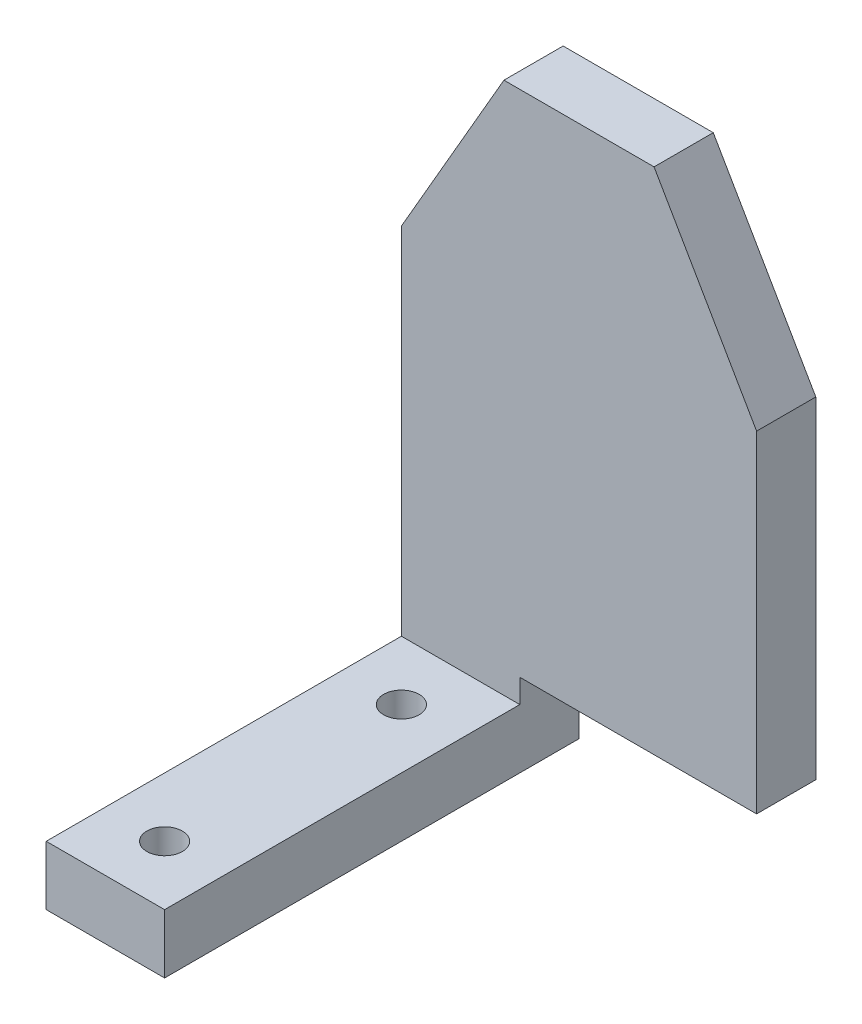
ISO-10303-21;
HEADER;
FILE_DESCRIPTION(('STEP AP214'),'2;1');
FILE_NAME('part.step','',(''),(''),'','','');
FILE_SCHEMA(('AUTOMOTIVE_DESIGN { 1 0 10303 214 1 1 1 1 }'));
ENDSEC;
DATA;
#1=APPLICATION_CONTEXT('core data for automotive mechanical design processes');
#2=APPLICATION_PROTOCOL_DEFINITION('international standard','automotive_design',2000,#1);
#3=PRODUCT_CONTEXT('',#1,'mechanical');
#4=PRODUCT('Part','Part','',(#3));
#5=PRODUCT_RELATED_PRODUCT_CATEGORY('part','',(#4));
#6=PRODUCT_DEFINITION_FORMATION('','',#4);
#7=PRODUCT_DEFINITION_CONTEXT('part definition',#1,'design');
#8=PRODUCT_DEFINITION('design','',#6,#7);
#9=PRODUCT_DEFINITION_SHAPE('','',#8);
#10=(LENGTH_UNIT() NAMED_UNIT(*) SI_UNIT(.MILLI.,.METRE.));
#11=(NAMED_UNIT(*) PLANE_ANGLE_UNIT() SI_UNIT($,.RADIAN.));
#12=(NAMED_UNIT(*) SI_UNIT($,.STERADIAN.) SOLID_ANGLE_UNIT());
#13=UNCERTAINTY_MEASURE_WITH_UNIT(LENGTH_MEASURE(1.E-05),#10,'distance_accuracy_value','');
#14=(GEOMETRIC_REPRESENTATION_CONTEXT(3) GLOBAL_UNCERTAINTY_ASSIGNED_CONTEXT((#13)) GLOBAL_UNIT_ASSIGNED_CONTEXT((#10,
#11,#12)) REPRESENTATION_CONTEXT('',''));
#15=CARTESIAN_POINT('',(0.,0.,0.));
#16=DIRECTION('',(0.,0.,1.));
#17=DIRECTION('',(1.,0.,0.));
#18=AXIS2_PLACEMENT_3D('',#15,#16,#17);
#19=CARTESIAN_POINT('',(0.,0.,5.));
#20=DIRECTION('',(0.,0.,-1.));
#21=DIRECTION('',(-1.,0.,0.));
#22=AXIS2_PLACEMENT_3D('',#19,#20,#21);
#23=PLANE('',#22);
#24=DIRECTION('',(0.,-1.,0.));
#25=VECTOR('',#24,1.);
#26=CARTESIAN_POINT('',(10.,0.,5.));
#27=LINE('',#26,#25);
#28=CARTESIAN_POINT('',(10.,7.,5.));
#29=VERTEX_POINT('',#28);
#30=CARTESIAN_POINT('',(10.,5.,5.));
#31=VERTEX_POINT('',#30);
#32=EDGE_CURVE('E133',#29,#31,#27,.T.);
#33=ORIENTED_EDGE('',*,*,#32,.F.);
#34=DIRECTION('',(-1.,0.,0.));
#35=VECTOR('',#34,1.);
#36=CARTESIAN_POINT('',(10.,7.,5.));
#37=LINE('',#36,#35);
#38=CARTESIAN_POINT('',(30.,7.,5.));
#39=VERTEX_POINT('',#38);
#40=EDGE_CURVE('E140',#39,#29,#37,.T.);
#41=ORIENTED_EDGE('',*,*,#40,.F.);
#42=DIRECTION('',(0.,1.,0.));
#43=VECTOR('',#42,1.);
#44=CARTESIAN_POINT('',(30.,0.,5.));
#45=LINE('',#44,#43);
#46=CARTESIAN_POINT('',(30.,35.,5.));
#47=VERTEX_POINT('',#46);
#48=EDGE_CURVE('E95',#39,#47,#45,.T.);
#49=ORIENTED_EDGE('',*,*,#48,.T.);
#50=DIRECTION('',(-0.499999999999995,0.866025403784441,0.));
#51=VECTOR('',#50,1.);
#52=CARTESIAN_POINT('',(21.3397459621557,50.,5.));
#53=LINE('',#52,#51);
#54=CARTESIAN_POINT('',(21.3397459621557,50.,5.));
#55=VERTEX_POINT('',#54);
#56=EDGE_CURVE('E184',#47,#55,#53,.T.);
#57=ORIENTED_EDGE('',*,*,#56,.T.);
#58=DIRECTION('',(-1.,0.,0.));
#59=VECTOR('',#58,1.);
#60=CARTESIAN_POINT('',(8.66025403784442,50.,5.));
#61=LINE('',#60,#59);
#62=CARTESIAN_POINT('',(8.66025403784442,50.,5.));
#63=VERTEX_POINT('',#62);
#64=EDGE_CURVE('E186',#55,#63,#61,.T.);
#65=ORIENTED_EDGE('',*,*,#64,.T.);
#66=DIRECTION('',(-0.500000000000001,-0.866025403784438,0.));
#67=VECTOR('',#66,1.);
#68=CARTESIAN_POINT('',(0.,35.,5.));
#69=LINE('',#68,#67);
#70=CARTESIAN_POINT('',(0.,35.,5.));
#71=VERTEX_POINT('',#70);
#72=EDGE_CURVE('E64',#63,#71,#69,.T.);
#73=ORIENTED_EDGE('',*,*,#72,.T.);
#74=DIRECTION('',(0.,-1.,0.));
#75=VECTOR('',#74,1.);
#76=CARTESIAN_POINT('',(0.,0.,5.));
#77=LINE('',#76,#75);
#78=CARTESIAN_POINT('',(0.,5.,5.));
#79=VERTEX_POINT('',#78);
#80=EDGE_CURVE('E58',#71,#79,#77,.T.);
#81=ORIENTED_EDGE('',*,*,#80,.T.);
#82=DIRECTION('',(-1.,0.,0.));
#83=VECTOR('',#82,1.);
#84=CARTESIAN_POINT('',(0.,5.,5.));
#85=LINE('',#84,#83);
#86=EDGE_CURVE('E145',#31,#79,#85,.T.);
#87=ORIENTED_EDGE('',*,*,#86,.F.);
#88=EDGE_LOOP('',(#33,#41,#49,#57,#65,#73,#81,#87));
#89=FACE_BOUND('',#88,.T.);
#90=ADVANCED_FACE('F43',(#89),#23,.F.);
#91=CARTESIAN_POINT('',(0.,0.,5.));
#92=DIRECTION('',(1.,0.,0.));
#93=DIRECTION('',(0.,0.,-1.));
#94=AXIS2_PLACEMENT_3D('',#91,#92,#93);
#95=PLANE('',#94);
#96=DIRECTION('',(0.,-1.,0.));
#97=VECTOR('',#96,1.);
#98=CARTESIAN_POINT('',(0.,0.,0.));
#99=LINE('',#98,#97);
#100=CARTESIAN_POINT('',(0.,35.,0.));
#101=VERTEX_POINT('',#100);
#102=CARTESIAN_POINT('',(0.,0.,0.));
#103=VERTEX_POINT('',#102);
#104=EDGE_CURVE('E181',#101,#103,#99,.T.);
#105=ORIENTED_EDGE('',*,*,#104,.T.);
#106=DIRECTION('',(0.,0.,-1.));
#107=VECTOR('',#106,1.);
#108=CARTESIAN_POINT('',(0.,0.,5.));
#109=LINE('',#108,#107);
#110=CARTESIAN_POINT('',(0.,0.,35.));
#111=VERTEX_POINT('',#110);
#112=EDGE_CURVE('E11',#111,#103,#109,.T.);
#113=ORIENTED_EDGE('',*,*,#112,.F.);
#114=DIRECTION('',(0.,-1.,0.));
#115=VECTOR('',#114,1.);
#116=CARTESIAN_POINT('',(0.,0.,35.));
#117=LINE('',#116,#115);
#118=CARTESIAN_POINT('',(0.,5.,35.));
#119=VERTEX_POINT('',#118);
#120=EDGE_CURVE('E164',#119,#111,#117,.T.);
#121=ORIENTED_EDGE('',*,*,#120,.F.);
#122=DIRECTION('',(0.,0.,-1.));
#123=VECTOR('',#122,1.);
#124=CARTESIAN_POINT('',(0.,5.,35.));
#125=LINE('',#124,#123);
#126=EDGE_CURVE('E173',#119,#79,#125,.T.);
#127=ORIENTED_EDGE('',*,*,#126,.T.);
#128=ORIENTED_EDGE('',*,*,#80,.F.);
#129=DIRECTION('',(0.,0.,-1.));
#130=VECTOR('',#129,1.);
#131=CARTESIAN_POINT('',(0.,35.,5.));
#132=LINE('',#131,#130);
#133=EDGE_CURVE('E189',#71,#101,#132,.T.);
#134=ORIENTED_EDGE('',*,*,#133,.T.);
#135=EDGE_LOOP('',(#105,#113,#121,#127,#128,#134));
#136=FACE_BOUND('',#135,.T.);
#137=ADVANCED_FACE('F45',(#136),#95,.F.);
#138=CARTESIAN_POINT('',(0.,0.,5.));
#139=DIRECTION('',(0.,1.,0.));
#140=DIRECTION('',(0.,0.,1.));
#141=AXIS2_PLACEMENT_3D('',#138,#139,#140);
#142=PLANE('',#141);
#143=CARTESIAN_POINT('',(5.,0.,10.));
#144=DIRECTION('',(0.,1.,0.));
#145=DIRECTION('',(0.,0.,1.));
#146=AXIS2_PLACEMENT_3D('',#143,#144,#145);
#147=CIRCLE('',#146,1.5);
#148=CARTESIAN_POINT('',(5.,0.,11.5));
#149=VERTEX_POINT('',#148);
#150=EDGE_CURVE('E156',#149,#149,#147,.F.);
#151=ORIENTED_EDGE('',*,*,#150,.F.);
#152=EDGE_LOOP('',(#151));
#153=FACE_BOUND('',#152,.T.);
#154=CARTESIAN_POINT('',(5.,0.,30.));
#155=DIRECTION('',(0.,1.,0.));
#156=DIRECTION('',(0.,0.,1.));
#157=AXIS2_PLACEMENT_3D('',#154,#155,#156);
#158=CIRCLE('',#157,1.5);
#159=CARTESIAN_POINT('',(5.,0.,31.5));
#160=VERTEX_POINT('',#159);
#161=EDGE_CURVE('E150',#160,#160,#158,.F.);
#162=ORIENTED_EDGE('',*,*,#161,.F.);
#163=EDGE_LOOP('',(#162));
#164=FACE_BOUND('',#163,.T.);
#165=DIRECTION('',(1.,0.,0.));
#166=VECTOR('',#165,1.);
#167=CARTESIAN_POINT('',(0.,0.,0.));
#168=LINE('',#167,#166);
#169=CARTESIAN_POINT('',(10.,0.,0.));
#170=VERTEX_POINT('',#169);
#171=EDGE_CURVE('E192',#103,#170,#168,.T.);
#172=ORIENTED_EDGE('',*,*,#171,.T.);
#173=DIRECTION('',(0.,0.,-1.));
#174=VECTOR('',#173,1.);
#175=CARTESIAN_POINT('',(10.,0.,35.));
#176=LINE('',#175,#174);
#177=CARTESIAN_POINT('',(10.,0.,35.));
#178=VERTEX_POINT('',#177);
#179=EDGE_CURVE('E179',#178,#170,#176,.T.);
#180=ORIENTED_EDGE('',*,*,#179,.F.);
#181=DIRECTION('',(1.,0.,0.));
#182=VECTOR('',#181,1.);
#183=CARTESIAN_POINT('',(0.,0.,35.));
#184=LINE('',#183,#182);
#185=EDGE_CURVE('E167',#111,#178,#184,.T.);
#186=ORIENTED_EDGE('',*,*,#185,.F.);
#187=ORIENTED_EDGE('',*,*,#112,.T.);
#188=EDGE_LOOP('',(#172,#180,#186,#187));
#189=FACE_BOUND('',#188,.T.);
#190=ADVANCED_FACE('F236',(#153,#164,#189),#142,.F.);
#191=CARTESIAN_POINT('',(30.,0.,5.));
#192=DIRECTION('',(-1.,0.,0.));
#193=DIRECTION('',(0.,0.,1.));
#194=AXIS2_PLACEMENT_3D('',#191,#192,#193);
#195=PLANE('',#194);
#196=ORIENTED_EDGE('',*,*,#48,.F.);
#197=DIRECTION('',(0.,0.,1.));
#198=VECTOR('',#197,1.);
#199=CARTESIAN_POINT('',(30.,7.,-21.1896201004171));
#200=LINE('',#199,#198);
#201=CARTESIAN_POINT('',(30.,7.,0.));
#202=VERTEX_POINT('',#201);
#203=EDGE_CURVE('E143',#202,#39,#200,.T.);
#204=ORIENTED_EDGE('',*,*,#203,.F.);
#205=DIRECTION('',(0.,1.,0.));
#206=VECTOR('',#205,1.);
#207=CARTESIAN_POINT('',(30.,0.,0.));
#208=LINE('',#207,#206);
#209=CARTESIAN_POINT('',(30.,35.,0.));
#210=VERTEX_POINT('',#209);
#211=EDGE_CURVE('E195',#202,#210,#208,.T.);
#212=ORIENTED_EDGE('',*,*,#211,.T.);
#213=DIRECTION('',(0.,0.,-1.));
#214=VECTOR('',#213,1.);
#215=CARTESIAN_POINT('',(30.,35.,5.));
#216=LINE('',#215,#214);
#217=EDGE_CURVE('E51',#47,#210,#216,.T.);
#218=ORIENTED_EDGE('',*,*,#217,.F.);
#219=EDGE_LOOP('',(#196,#204,#212,#218));
#220=FACE_BOUND('',#219,.T.);
#221=ADVANCED_FACE('F237',(#220),#195,.F.);
#222=CARTESIAN_POINT('',(21.3397459621557,50.,5.));
#223=DIRECTION('',(-0.866025403784441,-0.499999999999995,0.));
#224=DIRECTION('',(0.499999999999995,-0.866025403784441,0.));
#225=AXIS2_PLACEMENT_3D('',#222,#223,#224);
#226=PLANE('',#225);
#227=DIRECTION('',(-0.499999999999995,0.866025403784441,0.));
#228=VECTOR('',#227,1.);
#229=CARTESIAN_POINT('',(21.3397459621557,50.,0.));
#230=LINE('',#229,#228);
#231=CARTESIAN_POINT('',(21.3397459621557,50.,0.));
#232=VERTEX_POINT('',#231);
#233=EDGE_CURVE('E197',#210,#232,#230,.T.);
#234=ORIENTED_EDGE('',*,*,#233,.T.);
#235=DIRECTION('',(0.,0.,-1.));
#236=VECTOR('',#235,1.);
#237=CARTESIAN_POINT('',(21.3397459621557,50.,5.));
#238=LINE('',#237,#236);
#239=EDGE_CURVE('E205',#55,#232,#238,.T.);
#240=ORIENTED_EDGE('',*,*,#239,.F.);
#241=ORIENTED_EDGE('',*,*,#56,.F.);
#242=ORIENTED_EDGE('',*,*,#217,.T.);
#243=EDGE_LOOP('',(#234,#240,#241,#242));
#244=FACE_BOUND('',#243,.T.);
#245=ADVANCED_FACE('F211',(#244),#226,.F.);
#246=CARTESIAN_POINT('',(8.66025403784442,50.,5.));
#247=DIRECTION('',(0.,-1.,0.));
#248=DIRECTION('',(0.,0.,-1.));
#249=AXIS2_PLACEMENT_3D('',#246,#247,#248);
#250=PLANE('',#249);
#251=DIRECTION('',(-1.,0.,0.));
#252=VECTOR('',#251,1.);
#253=CARTESIAN_POINT('',(8.66025403784442,50.,0.));
#254=LINE('',#253,#252);
#255=CARTESIAN_POINT('',(8.66025403784442,50.,0.));
#256=VERTEX_POINT('',#255);
#257=EDGE_CURVE('E199',#232,#256,#254,.T.);
#258=ORIENTED_EDGE('',*,*,#257,.T.);
#259=DIRECTION('',(0.,0.,-1.));
#260=VECTOR('',#259,1.);
#261=CARTESIAN_POINT('',(8.66025403784442,50.,5.));
#262=LINE('',#261,#260);
#263=EDGE_CURVE('E203',#63,#256,#262,.T.);
#264=ORIENTED_EDGE('',*,*,#263,.F.);
#265=ORIENTED_EDGE('',*,*,#64,.F.);
#266=ORIENTED_EDGE('',*,*,#239,.T.);
#267=EDGE_LOOP('',(#258,#264,#265,#266));
#268=FACE_BOUND('',#267,.T.);
#269=ADVANCED_FACE('F221',(#268),#250,.F.);
#270=CARTESIAN_POINT('',(0.,35.,5.));
#271=DIRECTION('',(0.866025403784438,-0.500000000000001,0.));
#272=DIRECTION('',(0.500000000000001,0.866025403784438,0.));
#273=AXIS2_PLACEMENT_3D('',#270,#271,#272);
#274=PLANE('',#273);
#275=DIRECTION('',(-0.500000000000001,-0.866025403784438,0.));
#276=VECTOR('',#275,1.);
#277=CARTESIAN_POINT('',(0.,35.,0.));
#278=LINE('',#277,#276);
#279=EDGE_CURVE('E88',#256,#101,#278,.T.);
#280=ORIENTED_EDGE('',*,*,#279,.T.);
#281=ORIENTED_EDGE('',*,*,#133,.F.);
#282=ORIENTED_EDGE('',*,*,#72,.F.);
#283=ORIENTED_EDGE('',*,*,#263,.T.);
#284=EDGE_LOOP('',(#280,#281,#282,#283));
#285=FACE_BOUND('',#284,.T.);
#286=ADVANCED_FACE('F223',(#285),#274,.F.);
#287=CARTESIAN_POINT('',(0.,0.,0.));
#288=DIRECTION('',(0.,0.,-1.));
#289=DIRECTION('',(-1.,0.,0.));
#290=AXIS2_PLACEMENT_3D('',#287,#288,#289);
#291=PLANE('',#290);
#292=DIRECTION('',(-1.,0.,0.));
#293=VECTOR('',#292,1.);
#294=CARTESIAN_POINT('',(10.,7.,0.));
#295=LINE('',#294,#293);
#296=CARTESIAN_POINT('',(10.,7.,0.));
#297=VERTEX_POINT('',#296);
#298=EDGE_CURVE('E138',#202,#297,#295,.T.);
#299=ORIENTED_EDGE('',*,*,#298,.T.);
#300=DIRECTION('',(0.,-1.,0.));
#301=VECTOR('',#300,1.);
#302=CARTESIAN_POINT('',(10.,0.,0.));
#303=LINE('',#302,#301);
#304=EDGE_CURVE('E135',#297,#170,#303,.T.);
#305=ORIENTED_EDGE('',*,*,#304,.T.);
#306=ORIENTED_EDGE('',*,*,#171,.F.);
#307=ORIENTED_EDGE('',*,*,#104,.F.);
#308=ORIENTED_EDGE('',*,*,#279,.F.);
#309=ORIENTED_EDGE('',*,*,#257,.F.);
#310=ORIENTED_EDGE('',*,*,#233,.F.);
#311=ORIENTED_EDGE('',*,*,#211,.F.);
#312=EDGE_LOOP('',(#299,#305,#306,#307,#308,#309,#310,#311));
#313=FACE_BOUND('',#312,.T.);
#314=ADVANCED_FACE('F217',(#313),#291,.T.);
#315=CARTESIAN_POINT('',(10.,0.,35.));
#316=DIRECTION('',(-1.,0.,0.));
#317=DIRECTION('',(0.,0.,1.));
#318=AXIS2_PLACEMENT_3D('',#315,#316,#317);
#319=PLANE('',#318);
#320=ORIENTED_EDGE('',*,*,#179,.T.);
#321=ORIENTED_EDGE('',*,*,#304,.F.);
#322=DIRECTION('',(0.,0.,1.));
#323=VECTOR('',#322,1.);
#324=CARTESIAN_POINT('',(10.,7.,-21.1896201004171));
#325=LINE('',#324,#323);
#326=EDGE_CURVE('E128',#297,#29,#325,.T.);
#327=ORIENTED_EDGE('',*,*,#326,.T.);
#328=ORIENTED_EDGE('',*,*,#32,.T.);
#329=DIRECTION('',(0.,0.,-1.));
#330=VECTOR('',#329,1.);
#331=CARTESIAN_POINT('',(10.,5.,35.));
#332=LINE('',#331,#330);
#333=CARTESIAN_POINT('',(10.,5.,35.));
#334=VERTEX_POINT('',#333);
#335=EDGE_CURVE('E177',#334,#31,#332,.T.);
#336=ORIENTED_EDGE('',*,*,#335,.F.);
#337=DIRECTION('',(0.,1.,0.));
#338=VECTOR('',#337,1.);
#339=CARTESIAN_POINT('',(10.,0.,35.));
#340=LINE('',#339,#338);
#341=EDGE_CURVE('E169',#178,#334,#340,.T.);
#342=ORIENTED_EDGE('',*,*,#341,.F.);
#343=EDGE_LOOP('',(#320,#321,#327,#328,#336,#342));
#344=FACE_BOUND('',#343,.T.);
#345=ADVANCED_FACE('F130',(#344),#319,.F.);
#346=CARTESIAN_POINT('',(0.,5.,35.));
#347=DIRECTION('',(0.,-1.,0.));
#348=DIRECTION('',(0.,0.,-1.));
#349=AXIS2_PLACEMENT_3D('',#346,#347,#348);
#350=PLANE('',#349);
#351=CARTESIAN_POINT('',(5.,5.,10.));
#352=DIRECTION('',(0.,1.,0.));
#353=DIRECTION('',(0.,0.,1.));
#354=AXIS2_PLACEMENT_3D('',#351,#352,#353);
#355=CIRCLE('',#354,1.5);
#356=CARTESIAN_POINT('',(5.,5.,11.5));
#357=VERTEX_POINT('',#356);
#358=EDGE_CURVE('E153',#357,#357,#355,.T.);
#359=ORIENTED_EDGE('',*,*,#358,.F.);
#360=EDGE_LOOP('',(#359));
#361=FACE_BOUND('',#360,.T.);
#362=CARTESIAN_POINT('',(5.,5.,30.));
#363=DIRECTION('',(0.,1.,0.));
#364=DIRECTION('',(0.,0.,1.));
#365=AXIS2_PLACEMENT_3D('',#362,#363,#364);
#366=CIRCLE('',#365,1.5);
#367=CARTESIAN_POINT('',(5.,5.,31.5));
#368=VERTEX_POINT('',#367);
#369=EDGE_CURVE('E157',#368,#368,#366,.T.);
#370=ORIENTED_EDGE('',*,*,#369,.F.);
#371=EDGE_LOOP('',(#370));
#372=FACE_BOUND('',#371,.T.);
#373=ORIENTED_EDGE('',*,*,#86,.T.);
#374=ORIENTED_EDGE('',*,*,#126,.F.);
#375=DIRECTION('',(-1.,0.,0.));
#376=VECTOR('',#375,1.);
#377=CARTESIAN_POINT('',(0.,5.,35.));
#378=LINE('',#377,#376);
#379=EDGE_CURVE('E171',#334,#119,#378,.T.);
#380=ORIENTED_EDGE('',*,*,#379,.F.);
#381=ORIENTED_EDGE('',*,*,#335,.T.);
#382=EDGE_LOOP('',(#373,#374,#380,#381));
#383=FACE_BOUND('',#382,.T.);
#384=ADVANCED_FACE('F229',(#361,#372,#383),#350,.F.);
#385=CARTESIAN_POINT('',(0.,0.,35.));
#386=DIRECTION('',(0.,0.,-1.));
#387=DIRECTION('',(-1.,0.,0.));
#388=AXIS2_PLACEMENT_3D('',#385,#386,#387);
#389=PLANE('',#388);
#390=ORIENTED_EDGE('',*,*,#120,.T.);
#391=ORIENTED_EDGE('',*,*,#185,.T.);
#392=ORIENTED_EDGE('',*,*,#341,.T.);
#393=ORIENTED_EDGE('',*,*,#379,.T.);
#394=EDGE_LOOP('',(#390,#391,#392,#393));
#395=FACE_BOUND('',#394,.T.);
#396=ADVANCED_FACE('F233',(#395),#389,.F.);
#397=CARTESIAN_POINT('',(5.,-4.24264068711929,30.));
#398=DIRECTION('',(0.,1.,0.));
#399=DIRECTION('',(0.,0.,1.));
#400=AXIS2_PLACEMENT_3D('',#397,#398,#399);
#401=CYLINDRICAL_SURFACE('',#400,1.5);
#402=ORIENTED_EDGE('',*,*,#161,.T.);
#403=EDGE_LOOP('',(#402));
#404=FACE_BOUND('',#403,.T.);
#405=ORIENTED_EDGE('',*,*,#369,.T.);
#406=EDGE_LOOP('',(#405));
#407=FACE_BOUND('',#406,.T.);
#408=ADVANCED_FACE('F336',(#404,#407),#401,.F.);
#409=CARTESIAN_POINT('',(5.,-4.24264068711929,10.));
#410=DIRECTION('',(0.,1.,0.));
#411=DIRECTION('',(0.,0.,1.));
#412=AXIS2_PLACEMENT_3D('',#409,#410,#411);
#413=CYLINDRICAL_SURFACE('',#412,1.5);
#414=ORIENTED_EDGE('',*,*,#150,.T.);
#415=EDGE_LOOP('',(#414));
#416=FACE_BOUND('',#415,.T.);
#417=ORIENTED_EDGE('',*,*,#358,.T.);
#418=EDGE_LOOP('',(#417));
#419=FACE_BOUND('',#418,.T.);
#420=ADVANCED_FACE('F344',(#416,#419),#413,.F.);
#421=CARTESIAN_POINT('',(10.,7.,-21.1896201004171));
#422=DIRECTION('',(0.,1.,0.));
#423=DIRECTION('',(0.,0.,1.));
#424=AXIS2_PLACEMENT_3D('',#421,#422,#423);
#425=PLANE('',#424);
#426=ORIENTED_EDGE('',*,*,#203,.T.);
#427=ORIENTED_EDGE('',*,*,#40,.T.);
#428=ORIENTED_EDGE('',*,*,#326,.F.);
#429=ORIENTED_EDGE('',*,*,#298,.F.);
#430=EDGE_LOOP('',(#426,#427,#428,#429));
#431=FACE_BOUND('',#430,.T.);
#432=ADVANCED_FACE('F141',(#431),#425,.F.);
#433=CLOSED_SHELL('',(#90,#137,#190,#221,#245,#269,#286,#314,#345,#384,#396,#408,#420,#432));
#434=MANIFOLD_SOLID_BREP('B2',#433);
#435=ADVANCED_BREP_SHAPE_REPRESENTATION('',(#18,#434),#14);
#436=SHAPE_DEFINITION_REPRESENTATION(#9,#435);
ENDSEC;
END-ISO-10303-21;
